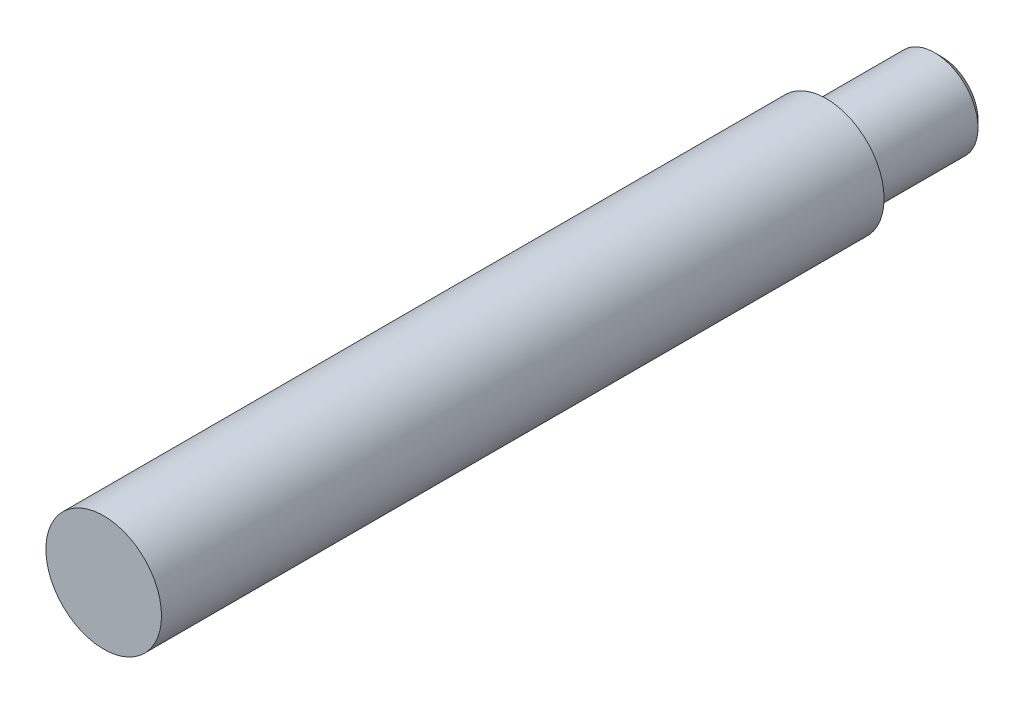
ISO-10303-21;
HEADER;
FILE_DESCRIPTION(('STEP AP214'),'2;1');
FILE_NAME('part.step','',(''),(''),'','','');
FILE_SCHEMA(('AUTOMOTIVE_DESIGN { 1 0 10303 214 1 1 1 1 }'));
ENDSEC;
DATA;
#1=APPLICATION_CONTEXT('core data for automotive mechanical design processes');
#2=APPLICATION_PROTOCOL_DEFINITION('international standard','automotive_design',2000,#1);
#3=PRODUCT_CONTEXT('',#1,'mechanical');
#4=PRODUCT('Part','Part','',(#3));
#5=PRODUCT_RELATED_PRODUCT_CATEGORY('part','',(#4));
#6=PRODUCT_DEFINITION_FORMATION('','',#4);
#7=PRODUCT_DEFINITION_CONTEXT('part definition',#1,'design');
#8=PRODUCT_DEFINITION('design','',#6,#7);
#9=PRODUCT_DEFINITION_SHAPE('','',#8);
#10=(LENGTH_UNIT() NAMED_UNIT(*) SI_UNIT(.MILLI.,.METRE.));
#11=(NAMED_UNIT(*) PLANE_ANGLE_UNIT() SI_UNIT($,.RADIAN.));
#12=(NAMED_UNIT(*) SI_UNIT($,.STERADIAN.) SOLID_ANGLE_UNIT());
#13=UNCERTAINTY_MEASURE_WITH_UNIT(LENGTH_MEASURE(1.E-05),#10,'distance_accuracy_value','');
#14=(GEOMETRIC_REPRESENTATION_CONTEXT(3) GLOBAL_UNCERTAINTY_ASSIGNED_CONTEXT((#13)) GLOBAL_UNIT_ASSIGNED_CONTEXT((#10,
#11,#12)) REPRESENTATION_CONTEXT('',''));
#15=CARTESIAN_POINT('',(0.,0.,0.));
#16=DIRECTION('',(0.,0.,1.));
#17=DIRECTION('',(1.,0.,0.));
#18=AXIS2_PLACEMENT_3D('',#15,#16,#17);
#19=CARTESIAN_POINT('',(0.,0.,8.));
#20=DIRECTION('',(0.,0.,-1.));
#21=DIRECTION('',(-1.,0.,0.));
#22=AXIS2_PLACEMENT_3D('',#19,#20,#21);
#23=CYLINDRICAL_SURFACE('',#22,3.);
#24=CARTESIAN_POINT('',(0.,0.,0.499999999999999));
#25=DIRECTION('',(0.,0.,1.));
#26=DIRECTION('',(1.,0.,0.));
#27=AXIS2_PLACEMENT_3D('',#24,#25,#26);
#28=CIRCLE('',#27,3.);
#29=CARTESIAN_POINT('',(3.,0.,0.499999999999999));
#30=VERTEX_POINT('',#29);
#31=EDGE_CURVE('E49',#30,#30,#28,.T.);
#32=ORIENTED_EDGE('',*,*,#31,.T.);
#33=EDGE_LOOP('',(#32));
#34=FACE_BOUND('',#33,.T.);
#35=CARTESIAN_POINT('',(0.,0.,8.));
#36=DIRECTION('',(0.,0.,1.));
#37=DIRECTION('',(1.,0.,0.));
#38=AXIS2_PLACEMENT_3D('',#35,#36,#37);
#39=CIRCLE('',#38,3.);
#40=CARTESIAN_POINT('',(3.,0.,8.));
#41=VERTEX_POINT('',#40);
#42=EDGE_CURVE('E53',#41,#41,#39,.T.);
#43=ORIENTED_EDGE('',*,*,#42,.F.);
#44=EDGE_LOOP('',(#43));
#45=FACE_BOUND('',#44,.T.);
#46=ADVANCED_FACE('F42',(#34,#45),#23,.T.);
#47=CARTESIAN_POINT('',(0.,0.,0.));
#48=DIRECTION('',(0.,0.,1.));
#49=DIRECTION('',(1.,0.,0.));
#50=AXIS2_PLACEMENT_3D('',#47,#48,#49);
#51=PLANE('',#50);
#52=CARTESIAN_POINT('',(0.,0.,0.));
#53=DIRECTION('',(0.,0.,1.));
#54=DIRECTION('',(1.,0.,0.));
#55=AXIS2_PLACEMENT_3D('',#52,#53,#54);
#56=CIRCLE('',#55,2.5);
#57=CARTESIAN_POINT('',(2.5,0.,0.));
#58=VERTEX_POINT('',#57);
#59=EDGE_CURVE('E12',#58,#58,#56,.F.);
#60=ORIENTED_EDGE('',*,*,#59,.T.);
#61=EDGE_LOOP('',(#60));
#62=FACE_BOUND('',#61,.T.);
#63=ADVANCED_FACE('F83',(#62),#51,.F.);
#64=CARTESIAN_POINT('',(0.,0.,0.499999999999999));
#65=DIRECTION('',(0.,0.,1.));
#66=DIRECTION('',(1.,0.,0.));
#67=AXIS2_PLACEMENT_3D('',#64,#65,#66);
#68=CONICAL_SURFACE('',#67,3.,0.78539816339745);
#69=ORIENTED_EDGE('',*,*,#59,.F.);
#70=EDGE_LOOP('',(#69));
#71=FACE_BOUND('',#70,.T.);
#72=ORIENTED_EDGE('',*,*,#31,.F.);
#73=EDGE_LOOP('',(#72));
#74=FACE_BOUND('',#73,.T.);
#75=ADVANCED_FACE('F44',(#71,#74),#68,.T.);
#76=CARTESIAN_POINT('',(0.,0.,58.));
#77=DIRECTION('',(0.,0.,-1.));
#78=DIRECTION('',(-1.,0.,0.));
#79=AXIS2_PLACEMENT_3D('',#76,#77,#78);
#80=CYLINDRICAL_SURFACE('',#79,4.);
#81=CARTESIAN_POINT('',(0.,0.,58.));
#82=DIRECTION('',(0.,0.,1.));
#83=DIRECTION('',(1.,0.,0.));
#84=AXIS2_PLACEMENT_3D('',#81,#82,#83);
#85=CIRCLE('',#84,4.);
#86=CARTESIAN_POINT('',(4.,0.,58.));
#87=VERTEX_POINT('',#86);
#88=EDGE_CURVE('E57',#87,#87,#85,.T.);
#89=ORIENTED_EDGE('',*,*,#88,.F.);
#90=EDGE_LOOP('',(#89));
#91=FACE_BOUND('',#90,.T.);
#92=CARTESIAN_POINT('',(0.,0.,8.));
#93=DIRECTION('',(0.,0.,1.));
#94=DIRECTION('',(1.,0.,0.));
#95=AXIS2_PLACEMENT_3D('',#92,#93,#94);
#96=CIRCLE('',#95,4.);
#97=CARTESIAN_POINT('',(4.,0.,8.));
#98=VERTEX_POINT('',#97);
#99=EDGE_CURVE('E60',#98,#98,#96,.T.);
#100=ORIENTED_EDGE('',*,*,#99,.T.);
#101=EDGE_LOOP('',(#100));
#102=FACE_BOUND('',#101,.T.);
#103=ADVANCED_FACE('F68',(#91,#102),#80,.T.);
#104=CARTESIAN_POINT('',(0.,0.,58.));
#105=DIRECTION('',(0.,0.,1.));
#106=DIRECTION('',(1.,0.,0.));
#107=AXIS2_PLACEMENT_3D('',#104,#105,#106);
#108=PLANE('',#107);
#109=ORIENTED_EDGE('',*,*,#88,.T.);
#110=EDGE_LOOP('',(#109));
#111=FACE_BOUND('',#110,.T.);
#112=ADVANCED_FACE('F66',(#111),#108,.T.);
#113=CARTESIAN_POINT('',(0.,0.,8.));
#114=DIRECTION('',(0.,0.,1.));
#115=DIRECTION('',(1.,0.,0.));
#116=AXIS2_PLACEMENT_3D('',#113,#114,#115);
#117=PLANE('',#116);
#118=ORIENTED_EDGE('',*,*,#42,.T.);
#119=EDGE_LOOP('',(#118));
#120=FACE_BOUND('',#119,.T.);
#121=ORIENTED_EDGE('',*,*,#99,.F.);
#122=EDGE_LOOP('',(#121));
#123=FACE_BOUND('',#122,.T.);
#124=ADVANCED_FACE('F74',(#120,#123),#117,.F.);
#125=CLOSED_SHELL('',(#46,#63,#75,#103,#112,#124));
#126=MANIFOLD_SOLID_BREP('B2',#125);
#127=ADVANCED_BREP_SHAPE_REPRESENTATION('',(#18,#126),#14);
#128=SHAPE_DEFINITION_REPRESENTATION(#9,#127);
ENDSEC;
END-ISO-10303-21;
